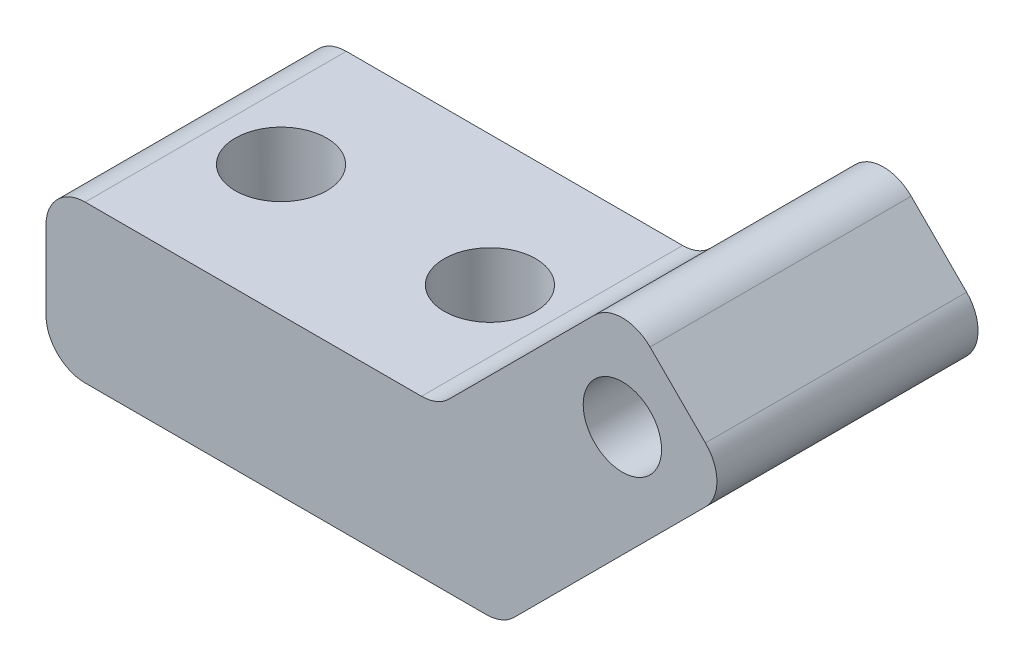
ISO-10303-21;
HEADER;
FILE_DESCRIPTION(('STEP AP214'),'2;1');
FILE_NAME('part.step','',(''),(''),'','','');
FILE_SCHEMA(('AUTOMOTIVE_DESIGN { 1 0 10303 214 1 1 1 1 }'));
ENDSEC;
DATA;
#1=APPLICATION_CONTEXT('core data for automotive mechanical design processes');
#2=APPLICATION_PROTOCOL_DEFINITION('international standard','automotive_design',2000,#1);
#3=PRODUCT_CONTEXT('',#1,'mechanical');
#4=PRODUCT('Part','Part','',(#3));
#5=PRODUCT_RELATED_PRODUCT_CATEGORY('part','',(#4));
#6=PRODUCT_DEFINITION_FORMATION('','',#4);
#7=PRODUCT_DEFINITION_CONTEXT('part definition',#1,'design');
#8=PRODUCT_DEFINITION('design','',#6,#7);
#9=PRODUCT_DEFINITION_SHAPE('','',#8);
#10=(LENGTH_UNIT() NAMED_UNIT(*) SI_UNIT(.MILLI.,.METRE.));
#11=(NAMED_UNIT(*) PLANE_ANGLE_UNIT() SI_UNIT($,.RADIAN.));
#12=(NAMED_UNIT(*) SI_UNIT($,.STERADIAN.) SOLID_ANGLE_UNIT());
#13=UNCERTAINTY_MEASURE_WITH_UNIT(LENGTH_MEASURE(1.E-05),#10,'distance_accuracy_value','');
#14=(GEOMETRIC_REPRESENTATION_CONTEXT(3) GLOBAL_UNCERTAINTY_ASSIGNED_CONTEXT((#13)) GLOBAL_UNIT_ASSIGNED_CONTEXT((#10,
#11,#12)) REPRESENTATION_CONTEXT('',''));
#15=CARTESIAN_POINT('',(0.,0.,0.));
#16=DIRECTION('',(0.,0.,1.));
#17=DIRECTION('',(1.,0.,0.));
#18=AXIS2_PLACEMENT_3D('',#15,#16,#17);
#19=CARTESIAN_POINT('',(0.,0.,20.));
#20=DIRECTION('',(1.,0.,0.));
#21=DIRECTION('',(0.,0.,-1.));
#22=AXIS2_PLACEMENT_3D('',#19,#20,#21);
#23=PLANE('',#22);
#24=DIRECTION('',(0.,-1.,0.));
#25=VECTOR('',#24,1.);
#26=CARTESIAN_POINT('',(0.,0.,0.));
#27=LINE('',#26,#25);
#28=CARTESIAN_POINT('',(0.,9.,0.));
#29=VERTEX_POINT('',#28);
#30=CARTESIAN_POINT('',(0.,3.,0.));
#31=VERTEX_POINT('',#30);
#32=EDGE_CURVE('E151',#29,#31,#27,.T.);
#33=ORIENTED_EDGE('',*,*,#32,.T.);
#34=DIRECTION('',(0.,0.,-1.));
#35=VECTOR('',#34,1.);
#36=CARTESIAN_POINT('',(0.,3.,20.));
#37=LINE('',#36,#35);
#38=CARTESIAN_POINT('',(0.,3.,20.));
#39=VERTEX_POINT('',#38);
#40=EDGE_CURVE('E128',#31,#39,#37,.F.);
#41=ORIENTED_EDGE('',*,*,#40,.T.);
#42=DIRECTION('',(0.,-1.,0.));
#43=VECTOR('',#42,1.);
#44=CARTESIAN_POINT('',(0.,0.,20.));
#45=LINE('',#44,#43);
#46=CARTESIAN_POINT('',(0.,9.,20.));
#47=VERTEX_POINT('',#46);
#48=EDGE_CURVE('E154',#47,#39,#45,.T.);
#49=ORIENTED_EDGE('',*,*,#48,.F.);
#50=DIRECTION('',(0.,0.,-1.));
#51=VECTOR('',#50,1.);
#52=CARTESIAN_POINT('',(0.,9.,20.));
#53=LINE('',#52,#51);
#54=EDGE_CURVE('E199',#47,#29,#53,.T.);
#55=ORIENTED_EDGE('',*,*,#54,.T.);
#56=EDGE_LOOP('',(#33,#41,#49,#55));
#57=FACE_BOUND('',#56,.T.);
#58=ADVANCED_FACE('F33',(#57),#23,.F.);
#59=CARTESIAN_POINT('',(0.,0.,20.));
#60=DIRECTION('',(0.,1.,0.));
#61=DIRECTION('',(0.,0.,1.));
#62=AXIS2_PLACEMENT_3D('',#59,#60,#61);
#63=PLANE('',#62);
#64=CARTESIAN_POINT('',(24.,0.,10.));
#65=DIRECTION('',(0.,1.,0.));
#66=DIRECTION('',(0.,0.,1.));
#67=AXIS2_PLACEMENT_3D('',#64,#65,#66);
#68=CIRCLE('',#67,3.5);
#69=CARTESIAN_POINT('',(24.,0.,13.5));
#70=VERTEX_POINT('',#69);
#71=EDGE_CURVE('E167',#70,#70,#68,.T.);
#72=ORIENTED_EDGE('',*,*,#71,.T.);
#73=EDGE_LOOP('',(#72));
#74=FACE_BOUND('',#73,.T.);
#75=CARTESIAN_POINT('',(8.,0.,10.));
#76=DIRECTION('',(0.,1.,0.));
#77=DIRECTION('',(0.,0.,1.));
#78=AXIS2_PLACEMENT_3D('',#75,#76,#77);
#79=CIRCLE('',#78,3.5);
#80=CARTESIAN_POINT('',(8.,0.,13.5));
#81=VERTEX_POINT('',#80);
#82=EDGE_CURVE('E164',#81,#81,#79,.T.);
#83=ORIENTED_EDGE('',*,*,#82,.T.);
#84=EDGE_LOOP('',(#83));
#85=FACE_BOUND('',#84,.T.);
#86=DIRECTION('',(1.,0.,0.));
#87=VECTOR('',#86,1.);
#88=CARTESIAN_POINT('',(0.,0.,0.));
#89=LINE('',#88,#87);
#90=CARTESIAN_POINT('',(3.,0.,0.));
#91=VERTEX_POINT('',#90);
#92=CARTESIAN_POINT('',(33.7279220613579,0.,0.));
#93=VERTEX_POINT('',#92);
#94=EDGE_CURVE('E140',#91,#93,#89,.T.);
#95=ORIENTED_EDGE('',*,*,#94,.T.);
#96=DIRECTION('',(0.,0.,1.));
#97=VECTOR('',#96,1.);
#98=CARTESIAN_POINT('',(33.7279220613579,0.,20.));
#99=LINE('',#98,#97);
#100=CARTESIAN_POINT('',(33.7279220613579,0.,20.));
#101=VERTEX_POINT('',#100);
#102=EDGE_CURVE('E144',#93,#101,#99,.T.);
#103=ORIENTED_EDGE('',*,*,#102,.T.);
#104=DIRECTION('',(1.,0.,0.));
#105=VECTOR('',#104,1.);
#106=CARTESIAN_POINT('',(0.,0.,20.));
#107=LINE('',#106,#105);
#108=CARTESIAN_POINT('',(3.,0.,20.));
#109=VERTEX_POINT('',#108);
#110=EDGE_CURVE('E143',#109,#101,#107,.T.);
#111=ORIENTED_EDGE('',*,*,#110,.F.);
#112=DIRECTION('',(0.,0.,-1.));
#113=VECTOR('',#112,1.);
#114=CARTESIAN_POINT('',(3.,0.,20.));
#115=LINE('',#114,#113);
#116=EDGE_CURVE('E127',#109,#91,#115,.T.);
#117=ORIENTED_EDGE('',*,*,#116,.T.);
#118=EDGE_LOOP('',(#95,#103,#111,#117));
#119=FACE_BOUND('',#118,.T.);
#120=ADVANCED_FACE('F138',(#74,#85,#119),#63,.F.);
#121=CARTESIAN_POINT('',(0.,12.,20.));
#122=DIRECTION('',(0.,-1.,0.));
#123=DIRECTION('',(0.,0.,-1.));
#124=AXIS2_PLACEMENT_3D('',#121,#122,#123);
#125=PLANE('',#124);
#126=CARTESIAN_POINT('',(24.,12.,10.));
#127=DIRECTION('',(0.,-1.,0.));
#128=DIRECTION('',(0.,0.,-1.));
#129=AXIS2_PLACEMENT_3D('',#126,#127,#128);
#130=CIRCLE('',#129,3.5);
#131=CARTESIAN_POINT('',(24.,12.,6.5));
#132=VERTEX_POINT('',#131);
#133=EDGE_CURVE('E165',#132,#132,#130,.T.);
#134=ORIENTED_EDGE('',*,*,#133,.T.);
#135=EDGE_LOOP('',(#134));
#136=FACE_BOUND('',#135,.T.);
#137=CARTESIAN_POINT('',(8.,12.,10.));
#138=DIRECTION('',(0.,-1.,0.));
#139=DIRECTION('',(0.,0.,-1.));
#140=AXIS2_PLACEMENT_3D('',#137,#138,#139);
#141=CIRCLE('',#140,3.5);
#142=CARTESIAN_POINT('',(8.,12.,6.5));
#143=VERTEX_POINT('',#142);
#144=EDGE_CURVE('E160',#143,#143,#141,.T.);
#145=ORIENTED_EDGE('',*,*,#144,.T.);
#146=EDGE_LOOP('',(#145));
#147=FACE_BOUND('',#146,.T.);
#148=DIRECTION('',(-1.,0.,0.));
#149=VECTOR('',#148,1.);
#150=CARTESIAN_POINT('',(0.,12.,20.));
#151=LINE('',#150,#149);
#152=CARTESIAN_POINT('',(28.7573593128807,12.,20.));
#153=VERTEX_POINT('',#152);
#154=CARTESIAN_POINT('',(3.,12.,20.));
#155=VERTEX_POINT('',#154);
#156=EDGE_CURVE('E145',#153,#155,#151,.T.);
#157=ORIENTED_EDGE('',*,*,#156,.F.);
#158=DIRECTION('',(0.,0.,-1.));
#159=VECTOR('',#158,1.);
#160=CARTESIAN_POINT('',(28.7573593128807,12.,20.));
#161=LINE('',#160,#159);
#162=CARTESIAN_POINT('',(28.7573593128807,12.,0.));
#163=VERTEX_POINT('',#162);
#164=EDGE_CURVE('E192',#153,#163,#161,.T.);
#165=ORIENTED_EDGE('',*,*,#164,.T.);
#166=DIRECTION('',(-1.,0.,0.));
#167=VECTOR('',#166,1.);
#168=CARTESIAN_POINT('',(0.,12.,0.));
#169=LINE('',#168,#167);
#170=CARTESIAN_POINT('',(3.,12.,0.));
#171=VERTEX_POINT('',#170);
#172=EDGE_CURVE('E150',#163,#171,#169,.T.);
#173=ORIENTED_EDGE('',*,*,#172,.T.);
#174=DIRECTION('',(0.,0.,-1.));
#175=VECTOR('',#174,1.);
#176=CARTESIAN_POINT('',(3.,12.,20.));
#177=LINE('',#176,#175);
#178=EDGE_CURVE('E190',#171,#155,#177,.F.);
#179=ORIENTED_EDGE('',*,*,#178,.T.);
#180=EDGE_LOOP('',(#157,#165,#173,#179));
#181=FACE_BOUND('',#180,.T.);
#182=ADVANCED_FACE('F227',(#136,#147,#181),#125,.F.);
#183=CARTESIAN_POINT('',(0.,0.,20.));
#184=DIRECTION('',(0.,0.,-1.));
#185=DIRECTION('',(-1.,0.,0.));
#186=AXIS2_PLACEMENT_3D('',#183,#184,#185);
#187=PLANE('',#186);
#188=CARTESIAN_POINT('',(44.1421356237309,17.6568542494924,20.));
#189=DIRECTION('',(0.,0.,-1.));
#190=DIRECTION('',(-1.,0.,0.));
#191=AXIS2_PLACEMENT_3D('',#188,#189,#190);
#192=CIRCLE('',#191,3.00000000000001);
#193=CARTESIAN_POINT('',(41.1421356237309,17.6568542494924,20.));
#194=VERTEX_POINT('',#193);
#195=EDGE_CURVE('E247',#194,#194,#192,.T.);
#196=ORIENTED_EDGE('',*,*,#195,.T.);
#197=EDGE_LOOP('',(#196));
#198=FACE_BOUND('',#197,.T.);
#199=ORIENTED_EDGE('',*,*,#110,.T.);
#200=CARTESIAN_POINT('',(33.7279220613579,3.,20.));
#201=DIRECTION('',(0.,0.,-1.));
#202=DIRECTION('',(-1.,0.,0.));
#203=AXIS2_PLACEMENT_3D('',#200,#201,#202);
#204=CIRCLE('',#203,3.);
#205=CARTESIAN_POINT('',(35.8492424049175,0.878679656440357,20.));
#206=VERTEX_POINT('',#205);
#207=EDGE_CURVE('E178',#101,#206,#204,.F.);
#208=ORIENTED_EDGE('',*,*,#207,.T.);
#209=DIRECTION('',(0.707106781186546,0.707106781186549,0.));
#210=VECTOR('',#209,1.);
#211=CARTESIAN_POINT('',(34.9705627484771,0.,20.));
#212=LINE('',#211,#210);
#213=CARTESIAN_POINT('',(50.5060966544099,15.5355339059328,20.));
#214=VERTEX_POINT('',#213);
#215=EDGE_CURVE('E163',#206,#214,#212,.T.);
#216=ORIENTED_EDGE('',*,*,#215,.T.);
#217=CARTESIAN_POINT('',(48.3847763108502,17.6568542494924,20.));
#218=DIRECTION('',(0.,0.,-1.));
#219=DIRECTION('',(-1.,0.,0.));
#220=AXIS2_PLACEMENT_3D('',#217,#218,#219);
#221=CIRCLE('',#220,3.);
#222=CARTESIAN_POINT('',(50.5060966544099,19.7781745930521,20.));
#223=VERTEX_POINT('',#222);
#224=EDGE_CURVE('E172',#214,#223,#221,.F.);
#225=ORIENTED_EDGE('',*,*,#224,.T.);
#226=DIRECTION('',(-0.707106781186549,0.707106781186546,0.));
#227=VECTOR('',#226,1.);
#228=CARTESIAN_POINT('',(52.6274169979695,17.6568542494924,20.));
#229=LINE('',#228,#227);
#230=CARTESIAN_POINT('',(46.2634559672906,24.0208152801713,20.));
#231=VERTEX_POINT('',#230);
#232=EDGE_CURVE('E235',#223,#231,#229,.T.);
#233=ORIENTED_EDGE('',*,*,#232,.T.);
#234=CARTESIAN_POINT('',(44.1421356237309,21.8994949366117,20.));
#235=DIRECTION('',(0.,0.,-1.));
#236=DIRECTION('',(-1.,0.,0.));
#237=AXIS2_PLACEMENT_3D('',#234,#235,#236);
#238=CIRCLE('',#237,3.);
#239=CARTESIAN_POINT('',(42.0208152801713,24.0208152801713,20.));
#240=VERTEX_POINT('',#239);
#241=EDGE_CURVE('E170',#231,#240,#238,.F.);
#242=ORIENTED_EDGE('',*,*,#241,.T.);
#243=DIRECTION('',(-0.707106781186546,-0.707106781186549,0.));
#244=VECTOR('',#243,1.);
#245=CARTESIAN_POINT('',(44.1421356237309,26.142135623731,20.));
#246=LINE('',#245,#244);
#247=CARTESIAN_POINT('',(30.8786796564404,12.8786796564404,20.));
#248=VERTEX_POINT('',#247);
#249=EDGE_CURVE('E225',#240,#248,#246,.T.);
#250=ORIENTED_EDGE('',*,*,#249,.T.);
#251=CARTESIAN_POINT('',(28.7573593128807,15.,20.));
#252=DIRECTION('',(0.,0.,-1.));
#253=DIRECTION('',(-1.,0.,0.));
#254=AXIS2_PLACEMENT_3D('',#251,#252,#253);
#255=CIRCLE('',#254,3.);
#256=EDGE_CURVE('E11',#248,#153,#255,.T.);
#257=ORIENTED_EDGE('',*,*,#256,.T.);
#258=ORIENTED_EDGE('',*,*,#156,.T.);
#259=CARTESIAN_POINT('',(3.,9.,20.));
#260=DIRECTION('',(0.,0.,-1.));
#261=DIRECTION('',(-1.,0.,0.));
#262=AXIS2_PLACEMENT_3D('',#259,#260,#261);
#263=CIRCLE('',#262,3.);
#264=EDGE_CURVE('E174',#155,#47,#263,.F.);
#265=ORIENTED_EDGE('',*,*,#264,.T.);
#266=ORIENTED_EDGE('',*,*,#48,.T.);
#267=CARTESIAN_POINT('',(3.,3.,20.));
#268=DIRECTION('',(0.,0.,-1.));
#269=DIRECTION('',(-1.,0.,0.));
#270=AXIS2_PLACEMENT_3D('',#267,#268,#269);
#271=CIRCLE('',#270,3.);
#272=EDGE_CURVE('E176',#39,#109,#271,.F.);
#273=ORIENTED_EDGE('',*,*,#272,.T.);
#274=EDGE_LOOP('',(#199,#208,#216,#225,#233,#242,#250,#257,#258,#265,#266,#273));
#275=FACE_BOUND('',#274,.T.);
#276=ADVANCED_FACE('F223',(#198,#275),#187,.F.);
#277=CARTESIAN_POINT('',(0.,0.,0.));
#278=DIRECTION('',(0.,0.,-1.));
#279=DIRECTION('',(-1.,0.,0.));
#280=AXIS2_PLACEMENT_3D('',#277,#278,#279);
#281=PLANE('',#280);
#282=CARTESIAN_POINT('',(44.1421356237309,17.6568542494924,0.));
#283=DIRECTION('',(0.,0.,1.));
#284=DIRECTION('',(1.,0.,0.));
#285=AXIS2_PLACEMENT_3D('',#282,#283,#284);
#286=CIRCLE('',#285,3.00000000000001);
#287=CARTESIAN_POINT('',(47.1421356237309,17.6568542494924,0.));
#288=VERTEX_POINT('',#287);
#289=EDGE_CURVE('E250',#288,#288,#286,.T.);
#290=ORIENTED_EDGE('',*,*,#289,.T.);
#291=EDGE_LOOP('',(#290));
#292=FACE_BOUND('',#291,.T.);
#293=DIRECTION('',(0.707106781186546,0.707106781186549,0.));
#294=VECTOR('',#293,1.);
#295=CARTESIAN_POINT('',(34.9705627484771,0.,0.));
#296=LINE('',#295,#294);
#297=CARTESIAN_POINT('',(35.8492424049175,0.878679656440357,0.));
#298=VERTEX_POINT('',#297);
#299=CARTESIAN_POINT('',(50.5060966544099,15.5355339059328,0.));
#300=VERTEX_POINT('',#299);
#301=EDGE_CURVE('E234',#298,#300,#296,.T.);
#302=ORIENTED_EDGE('',*,*,#301,.F.);
#303=CARTESIAN_POINT('',(33.7279220613579,3.,0.));
#304=DIRECTION('',(0.,0.,-1.));
#305=DIRECTION('',(-1.,0.,0.));
#306=AXIS2_PLACEMENT_3D('',#303,#304,#305);
#307=CIRCLE('',#306,3.);
#308=EDGE_CURVE('E132',#298,#93,#307,.T.);
#309=ORIENTED_EDGE('',*,*,#308,.T.);
#310=ORIENTED_EDGE('',*,*,#94,.F.);
#311=CARTESIAN_POINT('',(3.,3.,0.));
#312=DIRECTION('',(0.,0.,-1.));
#313=DIRECTION('',(-1.,0.,0.));
#314=AXIS2_PLACEMENT_3D('',#311,#312,#313);
#315=CIRCLE('',#314,3.);
#316=EDGE_CURVE('E123',#91,#31,#315,.T.);
#317=ORIENTED_EDGE('',*,*,#316,.T.);
#318=ORIENTED_EDGE('',*,*,#32,.F.);
#319=CARTESIAN_POINT('',(3.,9.,0.));
#320=DIRECTION('',(0.,0.,-1.));
#321=DIRECTION('',(-1.,0.,0.));
#322=AXIS2_PLACEMENT_3D('',#319,#320,#321);
#323=CIRCLE('',#322,3.);
#324=EDGE_CURVE('E133',#29,#171,#323,.T.);
#325=ORIENTED_EDGE('',*,*,#324,.T.);
#326=ORIENTED_EDGE('',*,*,#172,.F.);
#327=CARTESIAN_POINT('',(28.7573593128807,15.,0.));
#328=DIRECTION('',(0.,0.,-1.));
#329=DIRECTION('',(-1.,0.,0.));
#330=AXIS2_PLACEMENT_3D('',#327,#328,#329);
#331=CIRCLE('',#330,3.);
#332=CARTESIAN_POINT('',(30.8786796564404,12.8786796564404,0.));
#333=VERTEX_POINT('',#332);
#334=EDGE_CURVE('E41',#163,#333,#331,.F.);
#335=ORIENTED_EDGE('',*,*,#334,.T.);
#336=DIRECTION('',(-0.707106781186546,-0.707106781186549,0.));
#337=VECTOR('',#336,1.);
#338=CARTESIAN_POINT('',(44.1421356237309,26.142135623731,0.));
#339=LINE('',#338,#337);
#340=CARTESIAN_POINT('',(42.0208152801713,24.0208152801713,0.));
#341=VERTEX_POINT('',#340);
#342=EDGE_CURVE('E156',#341,#333,#339,.T.);
#343=ORIENTED_EDGE('',*,*,#342,.F.);
#344=CARTESIAN_POINT('',(44.1421356237309,21.8994949366117,0.));
#345=DIRECTION('',(0.,0.,-1.));
#346=DIRECTION('',(-1.,0.,0.));
#347=AXIS2_PLACEMENT_3D('',#344,#345,#346);
#348=CIRCLE('',#347,3.);
#349=CARTESIAN_POINT('',(46.2634559672906,24.0208152801713,0.));
#350=VERTEX_POINT('',#349);
#351=EDGE_CURVE('E48',#341,#350,#348,.T.);
#352=ORIENTED_EDGE('',*,*,#351,.T.);
#353=DIRECTION('',(-0.707106781186549,0.707106781186546,0.));
#354=VECTOR('',#353,1.);
#355=CARTESIAN_POINT('',(52.6274169979695,17.6568542494924,0.));
#356=LINE('',#355,#354);
#357=CARTESIAN_POINT('',(50.5060966544099,19.7781745930521,0.));
#358=VERTEX_POINT('',#357);
#359=EDGE_CURVE('E216',#358,#350,#356,.T.);
#360=ORIENTED_EDGE('',*,*,#359,.F.);
#361=CARTESIAN_POINT('',(48.3847763108502,17.6568542494924,0.));
#362=DIRECTION('',(0.,0.,-1.));
#363=DIRECTION('',(-1.,0.,0.));
#364=AXIS2_PLACEMENT_3D('',#361,#362,#363);
#365=CIRCLE('',#364,3.);
#366=EDGE_CURVE('E186',#358,#300,#365,.T.);
#367=ORIENTED_EDGE('',*,*,#366,.T.);
#368=EDGE_LOOP('',(#302,#309,#310,#317,#318,#325,#326,#335,#343,#352,#360,#367));
#369=FACE_BOUND('',#368,.T.);
#370=ADVANCED_FACE('F148',(#292,#369),#281,.T.);
#371=CARTESIAN_POINT('',(44.1421356237309,26.142135623731,0.));
#372=DIRECTION('',(-0.707106781186549,0.707106781186546,0.));
#373=DIRECTION('',(-0.707106781186546,-0.707106781186549,0.));
#374=AXIS2_PLACEMENT_3D('',#371,#372,#373);
#375=PLANE('',#374);
#376=ORIENTED_EDGE('',*,*,#342,.T.);
#377=DIRECTION('',(0.,0.,-1.));
#378=VECTOR('',#377,1.);
#379=CARTESIAN_POINT('',(30.8786796564404,12.8786796564404,0.));
#380=LINE('',#379,#378);
#381=EDGE_CURVE('E197',#333,#248,#380,.F.);
#382=ORIENTED_EDGE('',*,*,#381,.T.);
#383=ORIENTED_EDGE('',*,*,#249,.F.);
#384=DIRECTION('',(0.,0.,1.));
#385=VECTOR('',#384,1.);
#386=CARTESIAN_POINT('',(42.0208152801713,24.0208152801713,0.));
#387=LINE('',#386,#385);
#388=EDGE_CURVE('E195',#240,#341,#387,.F.);
#389=ORIENTED_EDGE('',*,*,#388,.T.);
#390=EDGE_LOOP('',(#376,#382,#383,#389));
#391=FACE_BOUND('',#390,.T.);
#392=ADVANCED_FACE('F212',(#391),#375,.T.);
#393=CARTESIAN_POINT('',(52.6274169979695,17.6568542494924,0.));
#394=DIRECTION('',(0.707106781186546,0.707106781186549,0.));
#395=DIRECTION('',(-0.707106781186549,0.707106781186546,0.));
#396=AXIS2_PLACEMENT_3D('',#393,#394,#395);
#397=PLANE('',#396);
#398=ORIENTED_EDGE('',*,*,#232,.F.);
#399=DIRECTION('',(0.,0.,1.));
#400=VECTOR('',#399,1.);
#401=CARTESIAN_POINT('',(50.5060966544099,19.7781745930521,0.));
#402=LINE('',#401,#400);
#403=EDGE_CURVE('E55',#223,#358,#402,.F.);
#404=ORIENTED_EDGE('',*,*,#403,.T.);
#405=ORIENTED_EDGE('',*,*,#359,.T.);
#406=DIRECTION('',(0.,0.,1.));
#407=VECTOR('',#406,1.);
#408=CARTESIAN_POINT('',(46.2634559672906,24.0208152801713,0.));
#409=LINE('',#408,#407);
#410=EDGE_CURVE('E203',#350,#231,#409,.T.);
#411=ORIENTED_EDGE('',*,*,#410,.T.);
#412=EDGE_LOOP('',(#398,#404,#405,#411));
#413=FACE_BOUND('',#412,.T.);
#414=ADVANCED_FACE('F307',(#413),#397,.T.);
#415=CARTESIAN_POINT('',(34.9705627484771,0.,0.));
#416=DIRECTION('',(0.707106781186549,-0.707106781186546,0.));
#417=DIRECTION('',(0.707106781186546,0.707106781186549,0.));
#418=AXIS2_PLACEMENT_3D('',#415,#416,#417);
#419=PLANE('',#418);
#420=ORIENTED_EDGE('',*,*,#215,.F.);
#421=DIRECTION('',(0.,0.,1.));
#422=VECTOR('',#421,1.);
#423=CARTESIAN_POINT('',(35.8492424049175,0.878679656440358,0.));
#424=LINE('',#423,#422);
#425=EDGE_CURVE('E183',#206,#298,#424,.F.);
#426=ORIENTED_EDGE('',*,*,#425,.T.);
#427=ORIENTED_EDGE('',*,*,#301,.T.);
#428=DIRECTION('',(0.,0.,1.));
#429=VECTOR('',#428,1.);
#430=CARTESIAN_POINT('',(50.5060966544099,15.5355339059328,0.));
#431=LINE('',#430,#429);
#432=EDGE_CURVE('E180',#300,#214,#431,.T.);
#433=ORIENTED_EDGE('',*,*,#432,.T.);
#434=EDGE_LOOP('',(#420,#426,#427,#433));
#435=FACE_BOUND('',#434,.T.);
#436=ADVANCED_FACE('F303',(#435),#419,.T.);
#437=CARTESIAN_POINT('',(8.,0.,10.));
#438=DIRECTION('',(0.,1.,0.));
#439=DIRECTION('',(0.,0.,1.));
#440=AXIS2_PLACEMENT_3D('',#437,#438,#439);
#441=CYLINDRICAL_SURFACE('',#440,3.5);
#442=ORIENTED_EDGE('',*,*,#82,.F.);
#443=EDGE_LOOP('',(#442));
#444=FACE_BOUND('',#443,.T.);
#445=ORIENTED_EDGE('',*,*,#144,.F.);
#446=EDGE_LOOP('',(#445));
#447=FACE_BOUND('',#446,.T.);
#448=ADVANCED_FACE('F315',(#444,#447),#441,.F.);
#449=CARTESIAN_POINT('',(24.,0.,10.));
#450=DIRECTION('',(0.,1.,0.));
#451=DIRECTION('',(0.,0.,1.));
#452=AXIS2_PLACEMENT_3D('',#449,#450,#451);
#453=CYLINDRICAL_SURFACE('',#452,3.5);
#454=ORIENTED_EDGE('',*,*,#71,.F.);
#455=EDGE_LOOP('',(#454));
#456=FACE_BOUND('',#455,.T.);
#457=ORIENTED_EDGE('',*,*,#133,.F.);
#458=EDGE_LOOP('',(#457));
#459=FACE_BOUND('',#458,.T.);
#460=ADVANCED_FACE('F259',(#456,#459),#453,.F.);
#461=CARTESIAN_POINT('',(44.1421356237309,17.6568542494924,0.));
#462=DIRECTION('',(0.,0.,1.));
#463=DIRECTION('',(1.,0.,0.));
#464=AXIS2_PLACEMENT_3D('',#461,#462,#463);
#465=CYLINDRICAL_SURFACE('',#464,3.00000000000001);
#466=ORIENTED_EDGE('',*,*,#289,.F.);
#467=EDGE_LOOP('',(#466));
#468=FACE_BOUND('',#467,.T.);
#469=ORIENTED_EDGE('',*,*,#195,.F.);
#470=EDGE_LOOP('',(#469));
#471=FACE_BOUND('',#470,.T.);
#472=ADVANCED_FACE('F255',(#468,#471),#465,.F.);
#473=CARTESIAN_POINT('',(33.7279220613579,3.,20.));
#474=DIRECTION('',(0.,0.,-1.));
#475=DIRECTION('',(-1.,0.,0.));
#476=AXIS2_PLACEMENT_3D('',#473,#474,#475);
#477=CYLINDRICAL_SURFACE('',#476,3.);
#478=ORIENTED_EDGE('',*,*,#308,.F.);
#479=ORIENTED_EDGE('',*,*,#425,.F.);
#480=ORIENTED_EDGE('',*,*,#207,.F.);
#481=ORIENTED_EDGE('',*,*,#102,.F.);
#482=EDGE_LOOP('',(#478,#479,#480,#481));
#483=FACE_BOUND('',#482,.T.);
#484=ADVANCED_FACE('F258',(#483),#477,.T.);
#485=CARTESIAN_POINT('',(28.7573593128807,15.,20.));
#486=DIRECTION('',(0.,0.,-1.));
#487=DIRECTION('',(-1.,0.,0.));
#488=AXIS2_PLACEMENT_3D('',#485,#486,#487);
#489=CYLINDRICAL_SURFACE('',#488,3.);
#490=ORIENTED_EDGE('',*,*,#256,.F.);
#491=ORIENTED_EDGE('',*,*,#381,.F.);
#492=ORIENTED_EDGE('',*,*,#334,.F.);
#493=ORIENTED_EDGE('',*,*,#164,.F.);
#494=EDGE_LOOP('',(#490,#491,#492,#493));
#495=FACE_BOUND('',#494,.T.);
#496=ADVANCED_FACE('F219',(#495),#489,.F.);
#497=CARTESIAN_POINT('',(3.,3.,20.));
#498=DIRECTION('',(0.,0.,-1.));
#499=DIRECTION('',(-1.,0.,0.));
#500=AXIS2_PLACEMENT_3D('',#497,#498,#499);
#501=CYLINDRICAL_SURFACE('',#500,3.);
#502=ORIENTED_EDGE('',*,*,#272,.F.);
#503=ORIENTED_EDGE('',*,*,#40,.F.);
#504=ORIENTED_EDGE('',*,*,#316,.F.);
#505=ORIENTED_EDGE('',*,*,#116,.F.);
#506=EDGE_LOOP('',(#502,#503,#504,#505));
#507=FACE_BOUND('',#506,.T.);
#508=ADVANCED_FACE('F126',(#507),#501,.T.);
#509=CARTESIAN_POINT('',(3.,9.,20.));
#510=DIRECTION('',(0.,0.,-1.));
#511=DIRECTION('',(-1.,0.,0.));
#512=AXIS2_PLACEMENT_3D('',#509,#510,#511);
#513=CYLINDRICAL_SURFACE('',#512,3.);
#514=ORIENTED_EDGE('',*,*,#264,.F.);
#515=ORIENTED_EDGE('',*,*,#178,.F.);
#516=ORIENTED_EDGE('',*,*,#324,.F.);
#517=ORIENTED_EDGE('',*,*,#54,.F.);
#518=EDGE_LOOP('',(#514,#515,#516,#517));
#519=FACE_BOUND('',#518,.T.);
#520=ADVANCED_FACE('F289',(#519),#513,.T.);
#521=CARTESIAN_POINT('',(48.3847763108502,17.6568542494924,0.));
#522=DIRECTION('',(0.,0.,1.));
#523=DIRECTION('',(1.,0.,0.));
#524=AXIS2_PLACEMENT_3D('',#521,#522,#523);
#525=CYLINDRICAL_SURFACE('',#524,3.);
#526=ORIENTED_EDGE('',*,*,#366,.F.);
#527=ORIENTED_EDGE('',*,*,#403,.F.);
#528=ORIENTED_EDGE('',*,*,#224,.F.);
#529=ORIENTED_EDGE('',*,*,#432,.F.);
#530=EDGE_LOOP('',(#526,#527,#528,#529));
#531=FACE_BOUND('',#530,.T.);
#532=ADVANCED_FACE('F291',(#531),#525,.T.);
#533=CARTESIAN_POINT('',(44.1421356237309,21.8994949366117,0.));
#534=DIRECTION('',(0.,0.,1.));
#535=DIRECTION('',(1.,0.,0.));
#536=AXIS2_PLACEMENT_3D('',#533,#534,#535);
#537=CYLINDRICAL_SURFACE('',#536,3.);
#538=ORIENTED_EDGE('',*,*,#351,.F.);
#539=ORIENTED_EDGE('',*,*,#388,.F.);
#540=ORIENTED_EDGE('',*,*,#241,.F.);
#541=ORIENTED_EDGE('',*,*,#410,.F.);
#542=EDGE_LOOP('',(#538,#539,#540,#541));
#543=FACE_BOUND('',#542,.T.);
#544=ADVANCED_FACE('F35',(#543),#537,.T.);
#545=CLOSED_SHELL('',(#58,#120,#182,#276,#370,#392,#414,#436,#448,#460,#472,#484,#496,#508,#520,
#532,#544));
#546=MANIFOLD_SOLID_BREP('B2',#545);
#547=ADVANCED_BREP_SHAPE_REPRESENTATION('',(#18,#546),#14);
#548=SHAPE_DEFINITION_REPRESENTATION(#9,#547);
ENDSEC;
END-ISO-10303-21;
